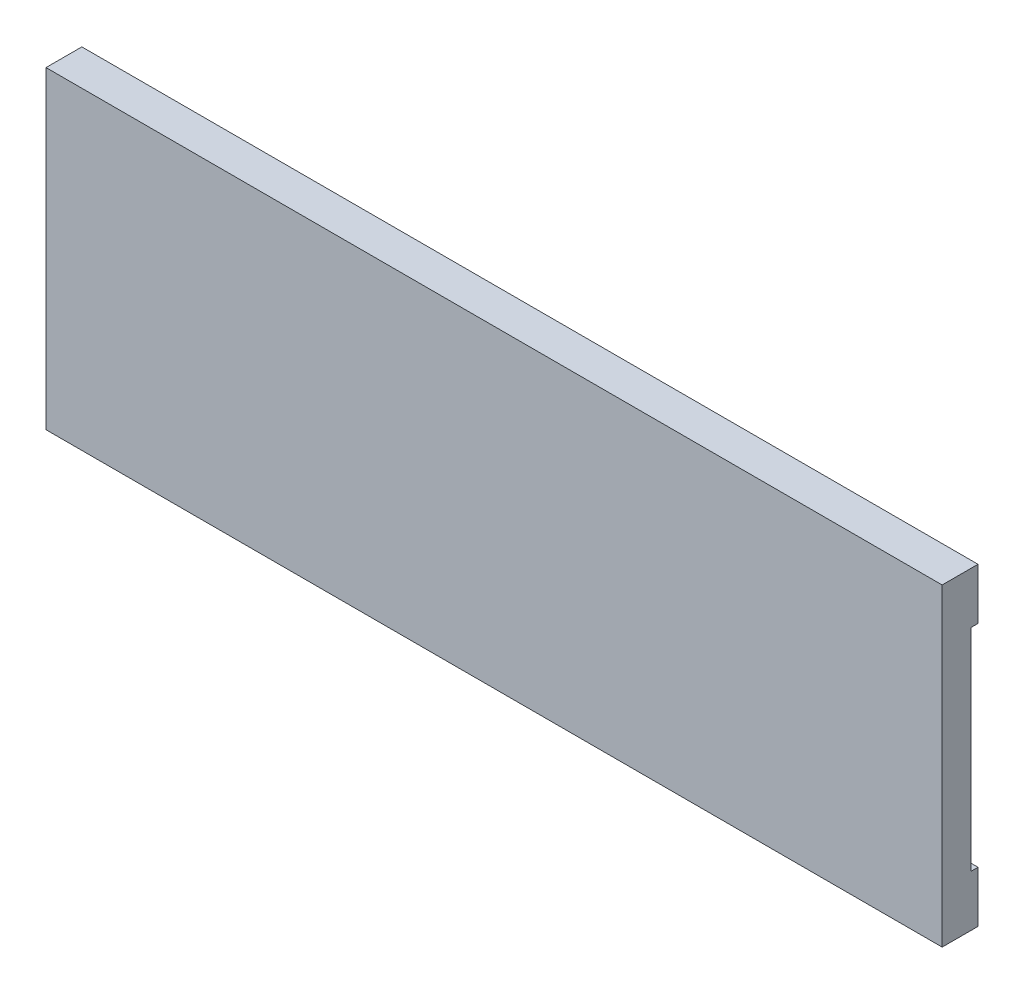
ISO-10303-21;
HEADER;
FILE_DESCRIPTION(('STEP AP214'),'2;1');
FILE_NAME('part.step','',(''),(''),'','','');
FILE_SCHEMA(('AUTOMOTIVE_DESIGN { 1 0 10303 214 1 1 1 1 }'));
ENDSEC;
DATA;
#1=APPLICATION_CONTEXT('core data for automotive mechanical design processes');
#2=APPLICATION_PROTOCOL_DEFINITION('international standard','automotive_design',2000,#1);
#3=PRODUCT_CONTEXT('',#1,'mechanical');
#4=PRODUCT('Part','Part','',(#3));
#5=PRODUCT_RELATED_PRODUCT_CATEGORY('part','',(#4));
#6=PRODUCT_DEFINITION_FORMATION('','',#4);
#7=PRODUCT_DEFINITION_CONTEXT('part definition',#1,'design');
#8=PRODUCT_DEFINITION('design','',#6,#7);
#9=PRODUCT_DEFINITION_SHAPE('','',#8);
#10=(LENGTH_UNIT() NAMED_UNIT(*) SI_UNIT(.MILLI.,.METRE.));
#11=(NAMED_UNIT(*) PLANE_ANGLE_UNIT() SI_UNIT($,.RADIAN.));
#12=(NAMED_UNIT(*) SI_UNIT($,.STERADIAN.) SOLID_ANGLE_UNIT());
#13=UNCERTAINTY_MEASURE_WITH_UNIT(LENGTH_MEASURE(1.E-05),#10,'distance_accuracy_value','');
#14=(GEOMETRIC_REPRESENTATION_CONTEXT(3) GLOBAL_UNCERTAINTY_ASSIGNED_CONTEXT((#13)) GLOBAL_UNIT_ASSIGNED_CONTEXT((#10,
#11,#12)) REPRESENTATION_CONTEXT('',''));
#15=CARTESIAN_POINT('',(0.,0.,0.));
#16=DIRECTION('',(0.,0.,1.));
#17=DIRECTION('',(1.,0.,0.));
#18=AXIS2_PLACEMENT_3D('',#15,#16,#17);
#19=CARTESIAN_POINT('',(63.5,22.225,5.08));
#20=DIRECTION('',(-1.,0.,0.));
#21=DIRECTION('',(0.,-1.,0.));
#22=AXIS2_PLACEMENT_3D('',#19,#20,#21);
#23=PLANE('',#22);
#24=DIRECTION('',(0.,-1.,0.));
#25=VECTOR('',#24,1.);
#26=CARTESIAN_POINT('',(63.5,-14.9606,0.9652));
#27=LINE('',#26,#25);
#28=CARTESIAN_POINT('',(63.5,14.9606,0.9652));
#29=VERTEX_POINT('',#28);
#30=CARTESIAN_POINT('',(63.5,-14.9606,0.9652));
#31=VERTEX_POINT('',#30);
#32=EDGE_CURVE('E125',#29,#31,#27,.T.);
#33=ORIENTED_EDGE('',*,*,#32,.F.);
#34=DIRECTION('',(0.,0.,-1.));
#35=VECTOR('',#34,1.);
#36=CARTESIAN_POINT('',(63.5,14.9606,0.9652));
#37=LINE('',#36,#35);
#38=CARTESIAN_POINT('',(63.5,14.9606,0.));
#39=VERTEX_POINT('',#38);
#40=EDGE_CURVE('E189',#29,#39,#37,.T.);
#41=ORIENTED_EDGE('',*,*,#40,.T.);
#42=DIRECTION('',(0.,1.,0.));
#43=VECTOR('',#42,1.);
#44=CARTESIAN_POINT('',(63.5,22.225,0.));
#45=LINE('',#44,#43);
#46=CARTESIAN_POINT('',(63.5,22.225,0.));
#47=VERTEX_POINT('',#46);
#48=EDGE_CURVE('E156',#39,#47,#45,.T.);
#49=ORIENTED_EDGE('',*,*,#48,.T.);
#50=DIRECTION('',(0.,0.,-1.));
#51=VECTOR('',#50,1.);
#52=CARTESIAN_POINT('',(63.5,22.225,5.08));
#53=LINE('',#52,#51);
#54=CARTESIAN_POINT('',(63.5,22.225,5.08));
#55=VERTEX_POINT('',#54);
#56=EDGE_CURVE('E11',#55,#47,#53,.T.);
#57=ORIENTED_EDGE('',*,*,#56,.F.);
#58=DIRECTION('',(0.,1.,0.));
#59=VECTOR('',#58,1.);
#60=CARTESIAN_POINT('',(63.5,22.225,5.08));
#61=LINE('',#60,#59);
#62=CARTESIAN_POINT('',(63.5,-22.225,5.08));
#63=VERTEX_POINT('',#62);
#64=EDGE_CURVE('E147',#63,#55,#61,.T.);
#65=ORIENTED_EDGE('',*,*,#64,.F.);
#66=DIRECTION('',(0.,0.,-1.));
#67=VECTOR('',#66,1.);
#68=CARTESIAN_POINT('',(63.5,-22.225,5.08));
#69=LINE('',#68,#67);
#70=CARTESIAN_POINT('',(63.5,-22.225,0.));
#71=VERTEX_POINT('',#70);
#72=EDGE_CURVE('E153',#63,#71,#69,.T.);
#73=ORIENTED_EDGE('',*,*,#72,.T.);
#74=CARTESIAN_POINT('',(63.5,-14.9606,0.));
#75=VERTEX_POINT('',#74);
#76=EDGE_CURVE('E139',#71,#75,#45,.T.);
#77=ORIENTED_EDGE('',*,*,#76,.T.);
#78=DIRECTION('',(0.,0.,-1.));
#79=VECTOR('',#78,1.);
#80=CARTESIAN_POINT('',(63.5,-14.9606,0.9652));
#81=LINE('',#80,#79);
#82=EDGE_CURVE('E47',#31,#75,#81,.T.);
#83=ORIENTED_EDGE('',*,*,#82,.F.);
#84=EDGE_LOOP('',(#33,#41,#49,#57,#65,#73,#77,#83));
#85=FACE_BOUND('',#84,.T.);
#86=ADVANCED_FACE('F33',(#85),#23,.F.);
#87=CARTESIAN_POINT('',(-63.5,22.225,5.08));
#88=DIRECTION('',(0.,-1.,0.));
#89=DIRECTION('',(0.,0.,-1.));
#90=AXIS2_PLACEMENT_3D('',#87,#88,#89);
#91=PLANE('',#90);
#92=DIRECTION('',(-1.,0.,0.));
#93=VECTOR('',#92,1.);
#94=CARTESIAN_POINT('',(-63.5,22.225,0.));
#95=LINE('',#94,#93);
#96=CARTESIAN_POINT('',(-63.5,22.225,0.));
#97=VERTEX_POINT('',#96);
#98=EDGE_CURVE('E155',#47,#97,#95,.T.);
#99=ORIENTED_EDGE('',*,*,#98,.T.);
#100=DIRECTION('',(0.,0.,-1.));
#101=VECTOR('',#100,1.);
#102=CARTESIAN_POINT('',(-63.5,22.225,5.08));
#103=LINE('',#102,#101);
#104=CARTESIAN_POINT('',(-63.5,22.225,5.08));
#105=VERTEX_POINT('',#104);
#106=EDGE_CURVE('E40',#105,#97,#103,.T.);
#107=ORIENTED_EDGE('',*,*,#106,.F.);
#108=DIRECTION('',(-1.,0.,0.));
#109=VECTOR('',#108,1.);
#110=CARTESIAN_POINT('',(-63.5,22.225,5.08));
#111=LINE('',#110,#109);
#112=EDGE_CURVE('E84',#55,#105,#111,.T.);
#113=ORIENTED_EDGE('',*,*,#112,.F.);
#114=ORIENTED_EDGE('',*,*,#56,.T.);
#115=EDGE_LOOP('',(#99,#107,#113,#114));
#116=FACE_BOUND('',#115,.T.);
#117=ADVANCED_FACE('F212',(#116),#91,.F.);
#118=CARTESIAN_POINT('',(-63.5,22.225,5.08));
#119=DIRECTION('',(1.,0.,0.));
#120=DIRECTION('',(0.,1.,0.));
#121=AXIS2_PLACEMENT_3D('',#118,#119,#120);
#122=PLANE('',#121);
#123=DIRECTION('',(0.,-1.,0.));
#124=VECTOR('',#123,1.);
#125=CARTESIAN_POINT('',(-63.5,22.225,0.));
#126=LINE('',#125,#124);
#127=CARTESIAN_POINT('',(-63.5,-22.225,0.));
#128=VERTEX_POINT('',#127);
#129=EDGE_CURVE('E158',#97,#128,#126,.T.);
#130=ORIENTED_EDGE('',*,*,#129,.T.);
#131=DIRECTION('',(0.,0.,-1.));
#132=VECTOR('',#131,1.);
#133=CARTESIAN_POINT('',(-63.5,-22.225,5.08));
#134=LINE('',#133,#132);
#135=CARTESIAN_POINT('',(-63.5,-22.225,5.08));
#136=VERTEX_POINT('',#135);
#137=EDGE_CURVE('E162',#136,#128,#134,.T.);
#138=ORIENTED_EDGE('',*,*,#137,.F.);
#139=DIRECTION('',(0.,-1.,0.));
#140=VECTOR('',#139,1.);
#141=CARTESIAN_POINT('',(-63.5,22.225,5.08));
#142=LINE('',#141,#140);
#143=EDGE_CURVE('E150',#105,#136,#142,.T.);
#144=ORIENTED_EDGE('',*,*,#143,.F.);
#145=ORIENTED_EDGE('',*,*,#106,.T.);
#146=EDGE_LOOP('',(#130,#138,#144,#145));
#147=FACE_BOUND('',#146,.T.);
#148=ADVANCED_FACE('F167',(#147),#122,.F.);
#149=CARTESIAN_POINT('',(-63.5,-22.225,5.08));
#150=DIRECTION('',(0.,1.,0.));
#151=DIRECTION('',(0.,0.,1.));
#152=AXIS2_PLACEMENT_3D('',#149,#150,#151);
#153=PLANE('',#152);
#154=DIRECTION('',(1.,0.,0.));
#155=VECTOR('',#154,1.);
#156=CARTESIAN_POINT('',(-63.5,-22.225,0.));
#157=LINE('',#156,#155);
#158=EDGE_CURVE('E77',#128,#71,#157,.T.);
#159=ORIENTED_EDGE('',*,*,#158,.T.);
#160=ORIENTED_EDGE('',*,*,#72,.F.);
#161=DIRECTION('',(1.,0.,0.));
#162=VECTOR('',#161,1.);
#163=CARTESIAN_POINT('',(-63.5,-22.225,5.08));
#164=LINE('',#163,#162);
#165=EDGE_CURVE('E56',#136,#63,#164,.T.);
#166=ORIENTED_EDGE('',*,*,#165,.F.);
#167=ORIENTED_EDGE('',*,*,#137,.T.);
#168=EDGE_LOOP('',(#159,#160,#166,#167));
#169=FACE_BOUND('',#168,.T.);
#170=ADVANCED_FACE('F218',(#169),#153,.F.);
#171=CARTESIAN_POINT('',(0.,0.,5.08));
#172=DIRECTION('',(0.,0.,1.));
#173=DIRECTION('',(1.,0.,0.));
#174=AXIS2_PLACEMENT_3D('',#171,#172,#173);
#175=PLANE('',#174);
#176=ORIENTED_EDGE('',*,*,#64,.T.);
#177=ORIENTED_EDGE('',*,*,#112,.T.);
#178=ORIENTED_EDGE('',*,*,#143,.T.);
#179=ORIENTED_EDGE('',*,*,#165,.T.);
#180=EDGE_LOOP('',(#176,#177,#178,#179));
#181=FACE_BOUND('',#180,.T.);
#182=ADVANCED_FACE('F223',(#181),#175,.T.);
#183=CARTESIAN_POINT('',(0.,0.,0.));
#184=DIRECTION('',(0.,0.,1.));
#185=DIRECTION('',(1.,0.,0.));
#186=AXIS2_PLACEMENT_3D('',#183,#184,#185);
#187=PLANE('',#186);
#188=ORIENTED_EDGE('',*,*,#48,.F.);
#189=DIRECTION('',(1.,0.,0.));
#190=VECTOR('',#189,1.);
#191=CARTESIAN_POINT('',(63.5,14.9606,0.));
#192=LINE('',#191,#190);
#193=CARTESIAN_POINT('',(34.3655367260524,14.9606,0.));
#194=VERTEX_POINT('',#193);
#195=EDGE_CURVE('E135',#194,#39,#192,.T.);
#196=ORIENTED_EDGE('',*,*,#195,.F.);
#197=CARTESIAN_POINT('',(34.3655367260524,8.61060000000002,0.));
#198=DIRECTION('',(0.,0.,-1.));
#199=DIRECTION('',(-1.,0.,0.));
#200=AXIS2_PLACEMENT_3D('',#197,#198,#199);
#201=CIRCLE('',#200,6.35);
#202=CARTESIAN_POINT('',(28.7333625864244,11.5433656675749,0.));
#203=VERTEX_POINT('',#202);
#204=EDGE_CURVE('E185',#203,#194,#201,.T.);
#205=ORIENTED_EDGE('',*,*,#204,.F.);
#206=CARTESIAN_POINT('',(50.9016,0.,0.));
#207=DIRECTION('',(0.,0.,-1.));
#208=DIRECTION('',(1.,0.,0.));
#209=AXIS2_PLACEMENT_3D('',#206,#207,#208);
#210=CIRCLE('',#209,24.9936);
#211=CARTESIAN_POINT('',(28.7333625864244,-11.5433656675749,0.));
#212=VERTEX_POINT('',#211);
#213=EDGE_CURVE('E179',#212,#203,#210,.T.);
#214=ORIENTED_EDGE('',*,*,#213,.F.);
#215=CARTESIAN_POINT('',(34.3655367260524,-8.61059999999999,0.));
#216=DIRECTION('',(0.,0.,-1.));
#217=DIRECTION('',(1.,0.,0.));
#218=AXIS2_PLACEMENT_3D('',#215,#216,#217);
#219=CIRCLE('',#218,6.35);
#220=CARTESIAN_POINT('',(34.3655367260524,-14.9606,0.));
#221=VERTEX_POINT('',#220);
#222=EDGE_CURVE('E177',#221,#212,#219,.T.);
#223=ORIENTED_EDGE('',*,*,#222,.F.);
#224=DIRECTION('',(-1.,0.,0.));
#225=VECTOR('',#224,1.);
#226=CARTESIAN_POINT('',(34.3655367260524,-14.9606,0.));
#227=LINE('',#226,#225);
#228=EDGE_CURVE('E174',#75,#221,#227,.T.);
#229=ORIENTED_EDGE('',*,*,#228,.F.);
#230=ORIENTED_EDGE('',*,*,#76,.F.);
#231=ORIENTED_EDGE('',*,*,#158,.F.);
#232=ORIENTED_EDGE('',*,*,#129,.F.);
#233=ORIENTED_EDGE('',*,*,#98,.F.);
#234=EDGE_LOOP('',(#188,#196,#205,#214,#223,#229,#230,#231,#232,#233));
#235=FACE_BOUND('',#234,.T.);
#236=ADVANCED_FACE('F172',(#235),#187,.F.);
#237=CARTESIAN_POINT('',(63.5,14.9606,0.9652));
#238=DIRECTION('',(0.,1.,0.));
#239=DIRECTION('',(-1.,0.,0.));
#240=AXIS2_PLACEMENT_3D('',#237,#238,#239);
#241=PLANE('',#240);
#242=ORIENTED_EDGE('',*,*,#195,.T.);
#243=ORIENTED_EDGE('',*,*,#40,.F.);
#244=DIRECTION('',(1.,0.,0.));
#245=VECTOR('',#244,1.);
#246=CARTESIAN_POINT('',(63.5,14.9606,0.9652));
#247=LINE('',#246,#245);
#248=CARTESIAN_POINT('',(34.3655367260524,14.9606,0.9652));
#249=VERTEX_POINT('',#248);
#250=EDGE_CURVE('E132',#249,#29,#247,.T.);
#251=ORIENTED_EDGE('',*,*,#250,.F.);
#252=DIRECTION('',(0.,0.,-1.));
#253=VECTOR('',#252,1.);
#254=CARTESIAN_POINT('',(34.3655367260524,14.9606,0.9652));
#255=LINE('',#254,#253);
#256=EDGE_CURVE('E191',#249,#194,#255,.T.);
#257=ORIENTED_EDGE('',*,*,#256,.T.);
#258=EDGE_LOOP('',(#242,#243,#251,#257));
#259=FACE_BOUND('',#258,.T.);
#260=ADVANCED_FACE('F209',(#259),#241,.F.);
#261=CARTESIAN_POINT('',(34.3655367260524,8.61060000000002,0.9652));
#262=DIRECTION('',(0.,0.,-1.));
#263=DIRECTION('',(-1.,0.,0.));
#264=AXIS2_PLACEMENT_3D('',#261,#262,#263);
#265=CYLINDRICAL_SURFACE('',#264,6.35);
#266=ORIENTED_EDGE('',*,*,#204,.T.);
#267=ORIENTED_EDGE('',*,*,#256,.F.);
#268=CARTESIAN_POINT('',(34.3655367260524,8.61060000000002,0.9652));
#269=DIRECTION('',(0.,0.,-1.));
#270=DIRECTION('',(-1.,0.,0.));
#271=AXIS2_PLACEMENT_3D('',#268,#269,#270);
#272=CIRCLE('',#271,6.35);
#273=CARTESIAN_POINT('',(28.7333625864244,11.5433656675749,0.9652));
#274=VERTEX_POINT('',#273);
#275=EDGE_CURVE('E143',#274,#249,#272,.T.);
#276=ORIENTED_EDGE('',*,*,#275,.F.);
#277=DIRECTION('',(0.,0.,-1.));
#278=VECTOR('',#277,1.);
#279=CARTESIAN_POINT('',(28.7333625864244,11.5433656675749,0.9652));
#280=LINE('',#279,#278);
#281=EDGE_CURVE('E193',#274,#203,#280,.T.);
#282=ORIENTED_EDGE('',*,*,#281,.T.);
#283=EDGE_LOOP('',(#266,#267,#276,#282));
#284=FACE_BOUND('',#283,.T.);
#285=ADVANCED_FACE('F204',(#284),#265,.F.);
#286=CARTESIAN_POINT('',(50.9016,0.,0.9652));
#287=DIRECTION('',(0.,0.,-1.));
#288=DIRECTION('',(-1.,0.,0.));
#289=AXIS2_PLACEMENT_3D('',#286,#287,#288);
#290=CYLINDRICAL_SURFACE('',#289,24.9936);
#291=ORIENTED_EDGE('',*,*,#213,.T.);
#292=ORIENTED_EDGE('',*,*,#281,.F.);
#293=CARTESIAN_POINT('',(50.9016,0.,0.9652));
#294=DIRECTION('',(0.,0.,-1.));
#295=DIRECTION('',(1.,0.,0.));
#296=AXIS2_PLACEMENT_3D('',#293,#294,#295);
#297=CIRCLE('',#296,24.9936);
#298=CARTESIAN_POINT('',(28.7333625864244,-11.5433656675749,0.9652));
#299=VERTEX_POINT('',#298);
#300=EDGE_CURVE('E199',#299,#274,#297,.T.);
#301=ORIENTED_EDGE('',*,*,#300,.F.);
#302=DIRECTION('',(0.,0.,-1.));
#303=VECTOR('',#302,1.);
#304=CARTESIAN_POINT('',(28.7333625864244,-11.5433656675749,0.9652));
#305=LINE('',#304,#303);
#306=EDGE_CURVE('E141',#299,#212,#305,.T.);
#307=ORIENTED_EDGE('',*,*,#306,.T.);
#308=EDGE_LOOP('',(#291,#292,#301,#307));
#309=FACE_BOUND('',#308,.T.);
#310=ADVANCED_FACE('F196',(#309),#290,.F.);
#311=CARTESIAN_POINT('',(34.3655367260524,-8.61059999999999,0.9652));
#312=DIRECTION('',(0.,0.,-1.));
#313=DIRECTION('',(-1.,0.,0.));
#314=AXIS2_PLACEMENT_3D('',#311,#312,#313);
#315=CYLINDRICAL_SURFACE('',#314,6.35);
#316=ORIENTED_EDGE('',*,*,#222,.T.);
#317=ORIENTED_EDGE('',*,*,#306,.F.);
#318=CARTESIAN_POINT('',(34.3655367260524,-8.61059999999999,0.9652));
#319=DIRECTION('',(0.,0.,-1.));
#320=DIRECTION('',(1.,0.,0.));
#321=AXIS2_PLACEMENT_3D('',#318,#319,#320);
#322=CIRCLE('',#321,6.35);
#323=CARTESIAN_POINT('',(34.3655367260524,-14.9606,0.9652));
#324=VERTEX_POINT('',#323);
#325=EDGE_CURVE('E124',#324,#299,#322,.T.);
#326=ORIENTED_EDGE('',*,*,#325,.F.);
#327=DIRECTION('',(0.,0.,-1.));
#328=VECTOR('',#327,1.);
#329=CARTESIAN_POINT('',(34.3655367260524,-14.9606,0.9652));
#330=LINE('',#329,#328);
#331=EDGE_CURVE('E120',#324,#221,#330,.T.);
#332=ORIENTED_EDGE('',*,*,#331,.T.);
#333=EDGE_LOOP('',(#316,#317,#326,#332));
#334=FACE_BOUND('',#333,.T.);
#335=ADVANCED_FACE('F201',(#334),#315,.F.);
#336=CARTESIAN_POINT('',(34.3655367260524,-14.9606,0.9652));
#337=DIRECTION('',(0.,-1.,0.));
#338=DIRECTION('',(1.,0.,0.));
#339=AXIS2_PLACEMENT_3D('',#336,#337,#338);
#340=PLANE('',#339);
#341=ORIENTED_EDGE('',*,*,#228,.T.);
#342=ORIENTED_EDGE('',*,*,#331,.F.);
#343=DIRECTION('',(-1.,0.,0.));
#344=VECTOR('',#343,1.);
#345=CARTESIAN_POINT('',(34.3655367260524,-14.9606,0.9652));
#346=LINE('',#345,#344);
#347=EDGE_CURVE('E117',#31,#324,#346,.T.);
#348=ORIENTED_EDGE('',*,*,#347,.F.);
#349=ORIENTED_EDGE('',*,*,#82,.T.);
#350=EDGE_LOOP('',(#341,#342,#348,#349));
#351=FACE_BOUND('',#350,.T.);
#352=ADVANCED_FACE('F119',(#351),#340,.F.);
#353=CARTESIAN_POINT('',(34.3655367260524,8.61060000000002,0.9652));
#354=DIRECTION('',(0.,0.,-1.));
#355=DIRECTION('',(-1.,0.,0.));
#356=AXIS2_PLACEMENT_3D('',#353,#354,#355);
#357=PLANE('',#356);
#358=ORIENTED_EDGE('',*,*,#32,.T.);
#359=ORIENTED_EDGE('',*,*,#347,.T.);
#360=ORIENTED_EDGE('',*,*,#325,.T.);
#361=ORIENTED_EDGE('',*,*,#300,.T.);
#362=ORIENTED_EDGE('',*,*,#275,.T.);
#363=ORIENTED_EDGE('',*,*,#250,.T.);
#364=EDGE_LOOP('',(#358,#359,#360,#361,#362,#363));
#365=FACE_BOUND('',#364,.T.);
#366=ADVANCED_FACE('F129',(#365),#357,.T.);
#367=CLOSED_SHELL('',(#86,#117,#148,#170,#182,#236,#260,#285,#310,#335,#352,#366));
#368=MANIFOLD_SOLID_BREP('B2',#367);
#369=ADVANCED_BREP_SHAPE_REPRESENTATION('',(#18,#368),#14);
#370=SHAPE_DEFINITION_REPRESENTATION(#9,#369);
ENDSEC;
END-ISO-10303-21;
